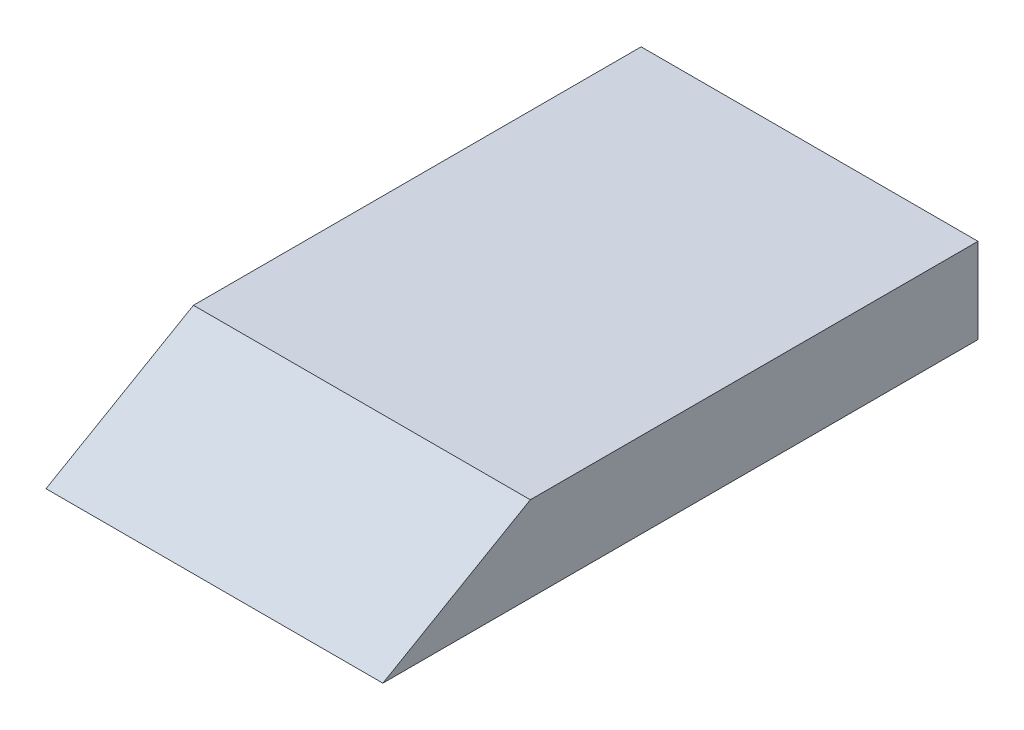
ISO-10303-21;
HEADER;
FILE_DESCRIPTION(('STEP AP214'),'2;1');
FILE_NAME('part.step','',(''),(''),'','','');
FILE_SCHEMA(('AUTOMOTIVE_DESIGN { 1 0 10303 214 1 1 1 1 }'));
ENDSEC;
DATA;
#1=APPLICATION_CONTEXT('core data for automotive mechanical design processes');
#2=APPLICATION_PROTOCOL_DEFINITION('international standard','automotive_design',2000,#1);
#3=PRODUCT_CONTEXT('',#1,'mechanical');
#4=PRODUCT('Part','Part','',(#3));
#5=PRODUCT_RELATED_PRODUCT_CATEGORY('part','',(#4));
#6=PRODUCT_DEFINITION_FORMATION('','',#4);
#7=PRODUCT_DEFINITION_CONTEXT('part definition',#1,'design');
#8=PRODUCT_DEFINITION('design','',#6,#7);
#9=PRODUCT_DEFINITION_SHAPE('','',#8);
#10=(LENGTH_UNIT() NAMED_UNIT(*) SI_UNIT(.MILLI.,.METRE.));
#11=(NAMED_UNIT(*) PLANE_ANGLE_UNIT() SI_UNIT($,.RADIAN.));
#12=(NAMED_UNIT(*) SI_UNIT($,.STERADIAN.) SOLID_ANGLE_UNIT());
#13=UNCERTAINTY_MEASURE_WITH_UNIT(LENGTH_MEASURE(1.E-05),#10,'distance_accuracy_value','');
#14=(GEOMETRIC_REPRESENTATION_CONTEXT(3) GLOBAL_UNCERTAINTY_ASSIGNED_CONTEXT((#13)) GLOBAL_UNIT_ASSIGNED_CONTEXT((#10,
#11,#12)) REPRESENTATION_CONTEXT('',''));
#15=CARTESIAN_POINT('',(0.,0.,0.));
#16=DIRECTION('',(0.,0.,1.));
#17=DIRECTION('',(1.,0.,0.));
#18=AXIS2_PLACEMENT_3D('',#15,#16,#17);
#19=CARTESIAN_POINT('',(-53.7694244604317,35.1762589928058,185.));
#20=DIRECTION('',(0.,0.866025403784438,0.500000000000001));
#21=DIRECTION('',(0.,-0.500000000000001,0.866025403784438));
#22=AXIS2_PLACEMENT_3D('',#19,#20,#21);
#23=PLANE('',#22);
#24=DIRECTION('',(1.,0.,0.));
#25=VECTOR('',#24,1.);
#26=CARTESIAN_POINT('',(-53.7694244604317,0.,245.927067795741));
#27=LINE('',#26,#25);
#28=CARTESIAN_POINT('',(85.4280575539568,0.,245.927067795741));
#29=VERTEX_POINT('',#28);
#30=CARTESIAN_POINT('',(-53.7694244604317,0.,245.927067795741));
#31=VERTEX_POINT('',#30);
#32=EDGE_CURVE('E11',#29,#31,#27,.F.);
#33=ORIENTED_EDGE('',*,*,#32,.F.);
#34=DIRECTION('',(0.,-0.500000000000001,0.866025403784438));
#35=VECTOR('',#34,1.);
#36=CARTESIAN_POINT('',(85.4280575539568,35.1762589928058,185.));
#37=LINE('',#36,#35);
#38=CARTESIAN_POINT('',(85.4280575539568,35.1762589928058,185.));
#39=VERTEX_POINT('',#38);
#40=EDGE_CURVE('E112',#29,#39,#37,.F.);
#41=ORIENTED_EDGE('',*,*,#40,.T.);
#42=DIRECTION('',(1.,0.,0.));
#43=VECTOR('',#42,1.);
#44=CARTESIAN_POINT('',(-53.7694244604317,35.1762589928058,185.));
#45=LINE('',#44,#43);
#46=CARTESIAN_POINT('',(-53.7694244604317,35.1762589928058,185.));
#47=VERTEX_POINT('',#46);
#48=EDGE_CURVE('E49',#47,#39,#45,.T.);
#49=ORIENTED_EDGE('',*,*,#48,.F.);
#50=DIRECTION('',(0.,-0.500000000000001,0.866025403784438));
#51=VECTOR('',#50,1.);
#52=CARTESIAN_POINT('',(-53.7694244604317,-6.09375839731222,256.481766948935));
#53=LINE('',#52,#51);
#54=EDGE_CURVE('E107',#31,#47,#53,.F.);
#55=ORIENTED_EDGE('',*,*,#54,.F.);
#56=EDGE_LOOP('',(#33,#41,#49,#55));
#57=FACE_BOUND('',#56,.T.);
#58=ADVANCED_FACE('F41',(#57),#23,.T.);
#59=CARTESIAN_POINT('',(-53.7694244604317,35.1762589928058,260.));
#60=DIRECTION('',(0.,-1.,0.));
#61=DIRECTION('',(0.,0.,-1.));
#62=AXIS2_PLACEMENT_3D('',#59,#60,#61);
#63=PLANE('',#62);
#64=DIRECTION('',(0.,0.,-1.));
#65=VECTOR('',#64,1.);
#66=CARTESIAN_POINT('',(-53.7694244604317,35.1762589928058,260.));
#67=LINE('',#66,#65);
#68=CARTESIAN_POINT('',(-53.7694244604317,35.1762589928058,0.));
#69=VERTEX_POINT('',#68);
#70=EDGE_CURVE('E99',#47,#69,#67,.T.);
#71=ORIENTED_EDGE('',*,*,#70,.F.);
#72=ORIENTED_EDGE('',*,*,#48,.T.);
#73=DIRECTION('',(0.,0.,-1.));
#74=VECTOR('',#73,1.);
#75=CARTESIAN_POINT('',(85.4280575539568,35.1762589928058,260.));
#76=LINE('',#75,#74);
#77=CARTESIAN_POINT('',(85.4280575539568,35.1762589928058,0.));
#78=VERTEX_POINT('',#77);
#79=EDGE_CURVE('E108',#39,#78,#76,.T.);
#80=ORIENTED_EDGE('',*,*,#79,.T.);
#81=DIRECTION('',(-1.,0.,0.));
#82=VECTOR('',#81,1.);
#83=CARTESIAN_POINT('',(-53.7694244604317,35.1762589928058,0.));
#84=LINE('',#83,#82);
#85=EDGE_CURVE('E93',#69,#78,#84,.F.);
#86=ORIENTED_EDGE('',*,*,#85,.F.);
#87=EDGE_LOOP('',(#71,#72,#80,#86));
#88=FACE_BOUND('',#87,.T.);
#89=ADVANCED_FACE('F125',(#88),#63,.F.);
#90=CARTESIAN_POINT('',(-53.7694244604317,0.,260.));
#91=DIRECTION('',(1.,0.,0.));
#92=DIRECTION('',(0.,0.,-1.));
#93=AXIS2_PLACEMENT_3D('',#90,#91,#92);
#94=PLANE('',#93);
#95=DIRECTION('',(0.,-1.,0.));
#96=VECTOR('',#95,1.);
#97=CARTESIAN_POINT('',(-53.7694244604317,0.,0.));
#98=LINE('',#97,#96);
#99=CARTESIAN_POINT('',(-53.7694244604317,0.,0.));
#100=VERTEX_POINT('',#99);
#101=EDGE_CURVE('E83',#69,#100,#98,.T.);
#102=ORIENTED_EDGE('',*,*,#101,.T.);
#103=DIRECTION('',(0.,0.,-1.));
#104=VECTOR('',#103,1.);
#105=CARTESIAN_POINT('',(-53.7694244604317,0.,260.));
#106=LINE('',#105,#104);
#107=EDGE_CURVE('E89',#31,#100,#106,.T.);
#108=ORIENTED_EDGE('',*,*,#107,.F.);
#109=ORIENTED_EDGE('',*,*,#54,.T.);
#110=ORIENTED_EDGE('',*,*,#70,.T.);
#111=EDGE_LOOP('',(#102,#108,#109,#110));
#112=FACE_BOUND('',#111,.T.);
#113=ADVANCED_FACE('F97',(#112),#94,.F.);
#114=CARTESIAN_POINT('',(-53.7694244604317,0.,260.));
#115=DIRECTION('',(0.,1.,0.));
#116=DIRECTION('',(0.,0.,1.));
#117=AXIS2_PLACEMENT_3D('',#114,#115,#116);
#118=PLANE('',#117);
#119=DIRECTION('',(0.,0.,-1.));
#120=VECTOR('',#119,1.);
#121=CARTESIAN_POINT('',(85.4280575539568,0.,260.));
#122=LINE('',#121,#120);
#123=CARTESIAN_POINT('',(85.4280575539568,0.,0.));
#124=VERTEX_POINT('',#123);
#125=EDGE_CURVE('E94',#29,#124,#122,.T.);
#126=ORIENTED_EDGE('',*,*,#125,.F.);
#127=ORIENTED_EDGE('',*,*,#32,.T.);
#128=ORIENTED_EDGE('',*,*,#107,.T.);
#129=DIRECTION('',(1.,0.,0.));
#130=VECTOR('',#129,1.);
#131=CARTESIAN_POINT('',(-53.7694244604317,0.,0.));
#132=LINE('',#131,#130);
#133=EDGE_CURVE('E80',#100,#124,#132,.T.);
#134=ORIENTED_EDGE('',*,*,#133,.T.);
#135=EDGE_LOOP('',(#126,#127,#128,#134));
#136=FACE_BOUND('',#135,.T.);
#137=ADVANCED_FACE('F90',(#136),#118,.F.);
#138=CARTESIAN_POINT('',(85.4280575539568,0.,260.));
#139=DIRECTION('',(-1.,0.,0.));
#140=DIRECTION('',(0.,0.,1.));
#141=AXIS2_PLACEMENT_3D('',#138,#139,#140);
#142=PLANE('',#141);
#143=DIRECTION('',(0.,1.,0.));
#144=VECTOR('',#143,1.);
#145=CARTESIAN_POINT('',(85.4280575539568,0.,0.));
#146=LINE('',#145,#144);
#147=EDGE_CURVE('E85',#124,#78,#146,.T.);
#148=ORIENTED_EDGE('',*,*,#147,.T.);
#149=ORIENTED_EDGE('',*,*,#79,.F.);
#150=ORIENTED_EDGE('',*,*,#40,.F.);
#151=ORIENTED_EDGE('',*,*,#125,.T.);
#152=EDGE_LOOP('',(#148,#149,#150,#151));
#153=FACE_BOUND('',#152,.T.);
#154=ADVANCED_FACE('F127',(#153),#142,.F.);
#155=CARTESIAN_POINT('',(-53.7694244604317,35.1762589928058,0.));
#156=DIRECTION('',(0.,0.,-1.));
#157=DIRECTION('',(-1.,0.,0.));
#158=AXIS2_PLACEMENT_3D('',#155,#156,#157);
#159=PLANE('',#158);
#160=ORIENTED_EDGE('',*,*,#101,.F.);
#161=ORIENTED_EDGE('',*,*,#85,.T.);
#162=ORIENTED_EDGE('',*,*,#147,.F.);
#163=ORIENTED_EDGE('',*,*,#133,.F.);
#164=EDGE_LOOP('',(#160,#161,#162,#163));
#165=FACE_BOUND('',#164,.T.);
#166=ADVANCED_FACE('F81',(#165),#159,.T.);
#167=CLOSED_SHELL('',(#58,#89,#113,#137,#154,#166));
#168=MANIFOLD_SOLID_BREP('B2',#167);
#169=ADVANCED_BREP_SHAPE_REPRESENTATION('',(#18,#168),#14);
#170=SHAPE_DEFINITION_REPRESENTATION(#9,#169);
ENDSEC;
END-ISO-10303-21;
